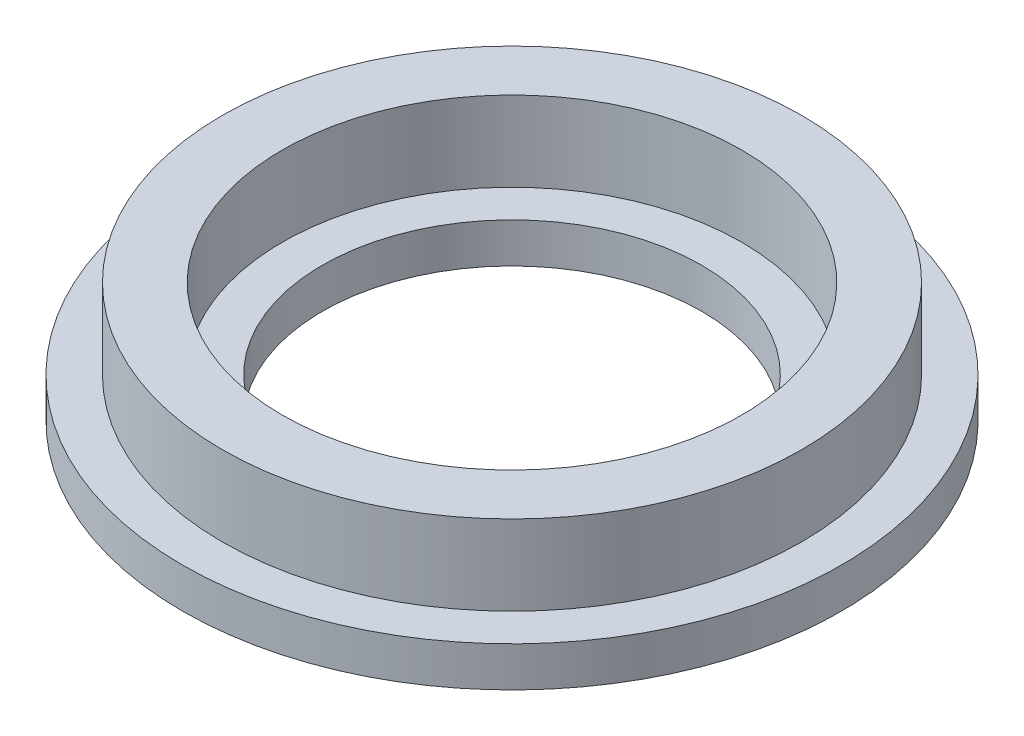
ISO-10303-21;
HEADER;
FILE_DESCRIPTION(('STEP AP214'),'2;1');
FILE_NAME('part.step','',(''),(''),'','','');
FILE_SCHEMA(('AUTOMOTIVE_DESIGN { 1 0 10303 214 1 1 1 1 }'));
ENDSEC;
DATA;
#1=APPLICATION_CONTEXT('core data for automotive mechanical design processes');
#2=APPLICATION_PROTOCOL_DEFINITION('international standard','automotive_design',2000,#1);
#3=PRODUCT_CONTEXT('',#1,'mechanical');
#4=PRODUCT('Part','Part','',(#3));
#5=PRODUCT_RELATED_PRODUCT_CATEGORY('part','',(#4));
#6=PRODUCT_DEFINITION_FORMATION('','',#4);
#7=PRODUCT_DEFINITION_CONTEXT('part definition',#1,'design');
#8=PRODUCT_DEFINITION('design','',#6,#7);
#9=PRODUCT_DEFINITION_SHAPE('','',#8);
#10=(LENGTH_UNIT() NAMED_UNIT(*) SI_UNIT(.MILLI.,.METRE.));
#11=(NAMED_UNIT(*) PLANE_ANGLE_UNIT() SI_UNIT($,.RADIAN.));
#12=(NAMED_UNIT(*) SI_UNIT($,.STERADIAN.) SOLID_ANGLE_UNIT());
#13=UNCERTAINTY_MEASURE_WITH_UNIT(LENGTH_MEASURE(1.E-05),#10,'distance_accuracy_value','');
#14=(GEOMETRIC_REPRESENTATION_CONTEXT(3) GLOBAL_UNCERTAINTY_ASSIGNED_CONTEXT((#13)) GLOBAL_UNIT_ASSIGNED_CONTEXT((#10,
#11,#12)) REPRESENTATION_CONTEXT('',''));
#15=CARTESIAN_POINT('',(0.,0.,0.));
#16=DIRECTION('',(0.,0.,1.));
#17=DIRECTION('',(1.,0.,0.));
#18=AXIS2_PLACEMENT_3D('',#15,#16,#17);
#19=CARTESIAN_POINT('',(0.,0.,0.));
#20=DIRECTION('',(0.,-1.,0.));
#21=DIRECTION('',(0.,0.,-1.));
#22=AXIS2_PLACEMENT_3D('',#19,#20,#21);
#23=CYLINDRICAL_SURFACE('',#22,9.5);
#24=CARTESIAN_POINT('',(0.,1.99999999999997,0.));
#25=DIRECTION('',(0.,-1.,0.));
#26=DIRECTION('',(0.,0.,-1.));
#27=AXIS2_PLACEMENT_3D('',#24,#25,#26);
#28=CIRCLE('',#27,9.5);
#29=CARTESIAN_POINT('',(0.,1.99999999999997,-9.5));
#30=VERTEX_POINT('',#29);
#31=EDGE_CURVE('E79',#30,#30,#28,.T.);
#32=ORIENTED_EDGE('',*,*,#31,.F.);
#33=EDGE_LOOP('',(#32));
#34=FACE_BOUND('',#33,.T.);
#35=CARTESIAN_POINT('',(0.,0.,0.));
#36=DIRECTION('',(0.,-1.,0.));
#37=DIRECTION('',(0.,0.,-1.));
#38=AXIS2_PLACEMENT_3D('',#35,#36,#37);
#39=CIRCLE('',#38,9.5);
#40=CARTESIAN_POINT('',(0.,0.,-9.5));
#41=VERTEX_POINT('',#40);
#42=EDGE_CURVE('E10',#41,#41,#39,.T.);
#43=ORIENTED_EDGE('',*,*,#42,.T.);
#44=EDGE_LOOP('',(#43));
#45=FACE_BOUND('',#44,.T.);
#46=ADVANCED_FACE('F41',(#34,#45),#23,.F.);
#47=CARTESIAN_POINT('',(-9.5,0.,0.));
#48=DIRECTION('',(0.,1.,0.));
#49=DIRECTION('',(0.,0.,1.));
#50=AXIS2_PLACEMENT_3D('',#47,#48,#49);
#51=PLANE('',#50);
#52=ORIENTED_EDGE('',*,*,#42,.F.);
#53=EDGE_LOOP('',(#52));
#54=FACE_BOUND('',#53,.T.);
#55=CARTESIAN_POINT('',(0.,0.,0.));
#56=DIRECTION('',(0.,-1.,0.));
#57=DIRECTION('',(0.,0.,-1.));
#58=AXIS2_PLACEMENT_3D('',#55,#56,#57);
#59=CIRCLE('',#58,16.5);
#60=CARTESIAN_POINT('',(0.,0.,-16.5));
#61=VERTEX_POINT('',#60);
#62=EDGE_CURVE('E48',#61,#61,#59,.T.);
#63=ORIENTED_EDGE('',*,*,#62,.T.);
#64=EDGE_LOOP('',(#63));
#65=FACE_BOUND('',#64,.T.);
#66=ADVANCED_FACE('F83',(#54,#65),#51,.F.);
#67=CARTESIAN_POINT('',(0.,0.,0.));
#68=DIRECTION('',(0.,-1.,0.));
#69=DIRECTION('',(0.,0.,-1.));
#70=AXIS2_PLACEMENT_3D('',#67,#68,#69);
#71=CYLINDRICAL_SURFACE('',#70,16.5);
#72=ORIENTED_EDGE('',*,*,#62,.F.);
#73=EDGE_LOOP('',(#72));
#74=FACE_BOUND('',#73,.T.);
#75=CARTESIAN_POINT('',(0.,2.,0.));
#76=DIRECTION('',(0.,-1.,0.));
#77=DIRECTION('',(0.,0.,-1.));
#78=AXIS2_PLACEMENT_3D('',#75,#76,#77);
#79=CIRCLE('',#78,16.5);
#80=CARTESIAN_POINT('',(0.,2.,-16.5));
#81=VERTEX_POINT('',#80);
#82=EDGE_CURVE('E52',#81,#81,#79,.T.);
#83=ORIENTED_EDGE('',*,*,#82,.T.);
#84=EDGE_LOOP('',(#83));
#85=FACE_BOUND('',#84,.T.);
#86=ADVANCED_FACE('F86',(#74,#85),#71,.T.);
#87=CARTESIAN_POINT('',(-16.5,1.99999999999998,0.));
#88=DIRECTION('',(0.,-1.,0.));
#89=DIRECTION('',(0.,0.,-1.));
#90=AXIS2_PLACEMENT_3D('',#87,#88,#89);
#91=PLANE('',#90);
#92=ORIENTED_EDGE('',*,*,#82,.F.);
#93=EDGE_LOOP('',(#92));
#94=FACE_BOUND('',#93,.T.);
#95=CARTESIAN_POINT('',(0.,1.99999999999997,0.));
#96=DIRECTION('',(0.,-1.,0.));
#97=DIRECTION('',(0.,0.,-1.));
#98=AXIS2_PLACEMENT_3D('',#95,#96,#97);
#99=CIRCLE('',#98,14.5);
#100=CARTESIAN_POINT('',(0.,1.99999999999997,-14.5));
#101=VERTEX_POINT('',#100);
#102=EDGE_CURVE('E59',#101,#101,#99,.T.);
#103=ORIENTED_EDGE('',*,*,#102,.T.);
#104=EDGE_LOOP('',(#103));
#105=FACE_BOUND('',#104,.T.);
#106=ADVANCED_FACE('F91',(#94,#105),#91,.F.);
#107=CARTESIAN_POINT('',(0.,0.,0.));
#108=DIRECTION('',(0.,-1.,0.));
#109=DIRECTION('',(0.,0.,-1.));
#110=AXIS2_PLACEMENT_3D('',#107,#108,#109);
#111=CYLINDRICAL_SURFACE('',#110,14.5);
#112=ORIENTED_EDGE('',*,*,#102,.F.);
#113=EDGE_LOOP('',(#112));
#114=FACE_BOUND('',#113,.T.);
#115=CARTESIAN_POINT('',(0.,5.99999999999997,0.));
#116=DIRECTION('',(0.,-1.,0.));
#117=DIRECTION('',(0.,0.,-1.));
#118=AXIS2_PLACEMENT_3D('',#115,#116,#117);
#119=CIRCLE('',#118,14.5);
#120=CARTESIAN_POINT('',(0.,5.99999999999997,-14.5));
#121=VERTEX_POINT('',#120);
#122=EDGE_CURVE('E63',#121,#121,#119,.T.);
#123=ORIENTED_EDGE('',*,*,#122,.T.);
#124=EDGE_LOOP('',(#123));
#125=FACE_BOUND('',#124,.T.);
#126=ADVANCED_FACE('F97',(#114,#125),#111,.T.);
#127=CARTESIAN_POINT('',(-14.5,5.99999999999997,0.));
#128=DIRECTION('',(0.,-1.,0.));
#129=DIRECTION('',(0.,0.,-1.));
#130=AXIS2_PLACEMENT_3D('',#127,#128,#129);
#131=PLANE('',#130);
#132=ORIENTED_EDGE('',*,*,#122,.F.);
#133=EDGE_LOOP('',(#132));
#134=FACE_BOUND('',#133,.T.);
#135=CARTESIAN_POINT('',(0.,5.99999999999997,0.));
#136=DIRECTION('',(0.,-1.,0.));
#137=DIRECTION('',(0.,0.,-1.));
#138=AXIS2_PLACEMENT_3D('',#135,#136,#137);
#139=CIRCLE('',#138,11.5);
#140=CARTESIAN_POINT('',(0.,5.99999999999997,-11.5));
#141=VERTEX_POINT('',#140);
#142=EDGE_CURVE('E70',#141,#141,#139,.T.);
#143=ORIENTED_EDGE('',*,*,#142,.T.);
#144=EDGE_LOOP('',(#143));
#145=FACE_BOUND('',#144,.T.);
#146=ADVANCED_FACE('F103',(#134,#145),#131,.F.);
#147=CARTESIAN_POINT('',(0.,0.,0.));
#148=DIRECTION('',(0.,-1.,0.));
#149=DIRECTION('',(0.,0.,-1.));
#150=AXIS2_PLACEMENT_3D('',#147,#148,#149);
#151=CYLINDRICAL_SURFACE('',#150,11.5);
#152=ORIENTED_EDGE('',*,*,#142,.F.);
#153=EDGE_LOOP('',(#152));
#154=FACE_BOUND('',#153,.T.);
#155=CARTESIAN_POINT('',(0.,1.99999999999997,0.));
#156=DIRECTION('',(0.,-1.,0.));
#157=DIRECTION('',(0.,0.,-1.));
#158=AXIS2_PLACEMENT_3D('',#155,#156,#157);
#159=CIRCLE('',#158,11.5);
#160=CARTESIAN_POINT('',(0.,1.99999999999997,-11.5));
#161=VERTEX_POINT('',#160);
#162=EDGE_CURVE('E75',#161,#161,#159,.T.);
#163=ORIENTED_EDGE('',*,*,#162,.T.);
#164=EDGE_LOOP('',(#163));
#165=FACE_BOUND('',#164,.T.);
#166=ADVANCED_FACE('F110',(#154,#165),#151,.F.);
#167=CARTESIAN_POINT('',(-9.5,1.99999999999997,0.));
#168=DIRECTION('',(0.,-1.,0.));
#169=DIRECTION('',(0.,0.,-1.));
#170=AXIS2_PLACEMENT_3D('',#167,#168,#169);
#171=PLANE('',#170);
#172=ORIENTED_EDGE('',*,*,#162,.F.);
#173=EDGE_LOOP('',(#172));
#174=FACE_BOUND('',#173,.T.);
#175=ORIENTED_EDGE('',*,*,#31,.T.);
#176=EDGE_LOOP('',(#175));
#177=FACE_BOUND('',#176,.T.);
#178=ADVANCED_FACE('F84',(#174,#177),#171,.F.);
#179=CLOSED_SHELL('',(#46,#66,#86,#106,#126,#146,#166,#178));
#180=MANIFOLD_SOLID_BREP('B2',#179);
#181=ADVANCED_BREP_SHAPE_REPRESENTATION('',(#18,#180),#14);
#182=SHAPE_DEFINITION_REPRESENTATION(#9,#181);
ENDSEC;
END-ISO-10303-21;
